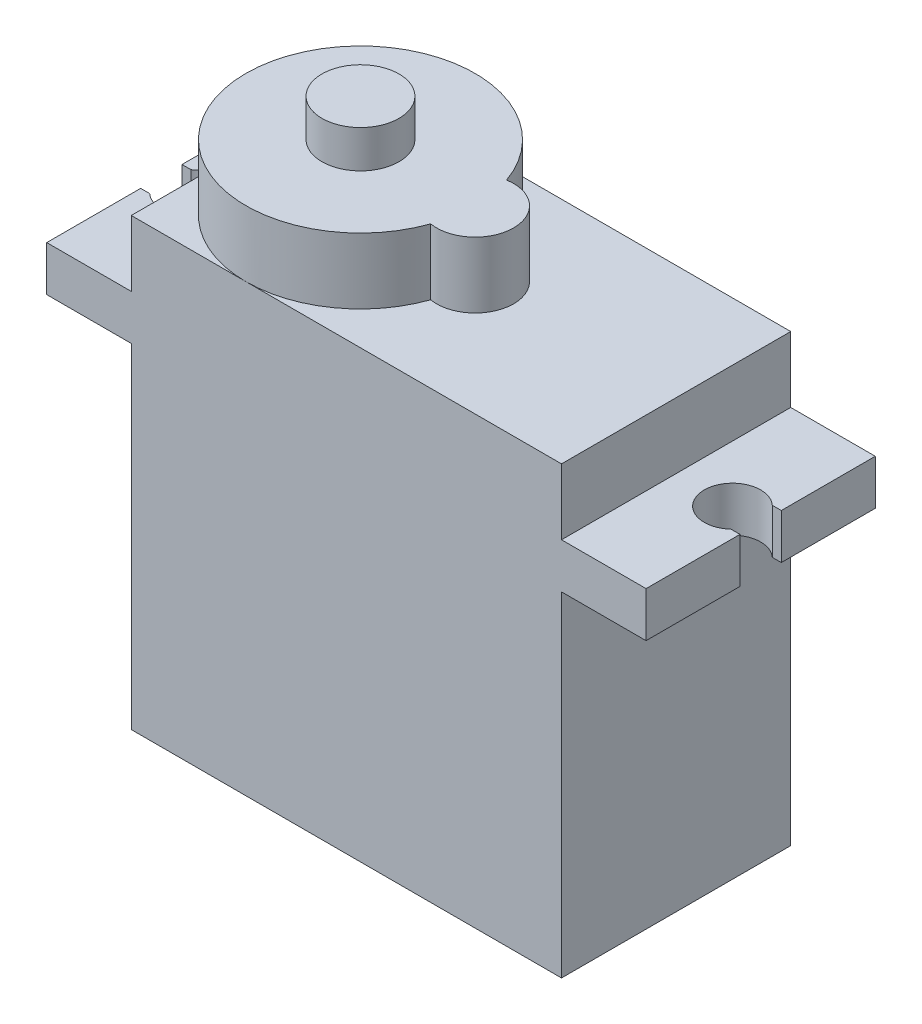
ISO-10303-21;
HEADER;
FILE_DESCRIPTION(('STEP AP214'),'2;1');
FILE_NAME('part.step','',(''),(''),'','','');
FILE_SCHEMA(('AUTOMOTIVE_DESIGN { 1 0 10303 214 1 1 1 1 }'));
ENDSEC;
DATA;
#1=APPLICATION_CONTEXT('core data for automotive mechanical design processes');
#2=APPLICATION_PROTOCOL_DEFINITION('international standard','automotive_design',2000,#1);
#3=PRODUCT_CONTEXT('',#1,'mechanical');
#4=PRODUCT('Part','Part','',(#3));
#5=PRODUCT_RELATED_PRODUCT_CATEGORY('part','',(#4));
#6=PRODUCT_DEFINITION_FORMATION('','',#4);
#7=PRODUCT_DEFINITION_CONTEXT('part definition',#1,'design');
#8=PRODUCT_DEFINITION('design','',#6,#7);
#9=PRODUCT_DEFINITION_SHAPE('','',#8);
#10=(LENGTH_UNIT() NAMED_UNIT(*) SI_UNIT(.MILLI.,.METRE.));
#11=(NAMED_UNIT(*) PLANE_ANGLE_UNIT() SI_UNIT($,.RADIAN.));
#12=(NAMED_UNIT(*) SI_UNIT($,.STERADIAN.) SOLID_ANGLE_UNIT());
#13=UNCERTAINTY_MEASURE_WITH_UNIT(LENGTH_MEASURE(1.E-05),#10,'distance_accuracy_value','');
#14=(GEOMETRIC_REPRESENTATION_CONTEXT(3) GLOBAL_UNCERTAINTY_ASSIGNED_CONTEXT((#13)) GLOBAL_UNIT_ASSIGNED_CONTEXT((#10,
#11,#12)) REPRESENTATION_CONTEXT('',''));
#15=CARTESIAN_POINT('',(0.,0.,0.));
#16=DIRECTION('',(0.,0.,1.));
#17=DIRECTION('',(1.,0.,0.));
#18=AXIS2_PLACEMENT_3D('',#15,#16,#17);
#19=CARTESIAN_POINT('',(15.95,0.,12.2));
#20=DIRECTION('',(1.,0.,0.));
#21=DIRECTION('',(0.,1.,0.));
#22=AXIS2_PLACEMENT_3D('',#19,#20,#21);
#23=PLANE('',#22);
#24=DIRECTION('',(0.,0.,-1.));
#25=VECTOR('',#24,1.);
#26=CARTESIAN_POINT('',(15.95,5.95000000000001,12.2));
#27=LINE('',#26,#25);
#28=CARTESIAN_POINT('',(15.95,5.95000000000001,12.2));
#29=VERTEX_POINT('',#28);
#30=CARTESIAN_POINT('',(15.95,5.95000000000001,7.2));
#31=VERTEX_POINT('',#30);
#32=EDGE_CURVE('E229',#29,#31,#27,.T.);
#33=ORIENTED_EDGE('',*,*,#32,.T.);
#34=DIRECTION('',(0.,1.,0.));
#35=VECTOR('',#34,1.);
#36=CARTESIAN_POINT('',(15.95,-11.851,7.2));
#37=LINE('',#36,#35);
#38=CARTESIAN_POINT('',(15.95,8.35,7.2));
#39=VERTEX_POINT('',#38);
#40=EDGE_CURVE('E222',#31,#39,#37,.T.);
#41=ORIENTED_EDGE('',*,*,#40,.T.);
#42=DIRECTION('',(0.,0.,-1.));
#43=VECTOR('',#42,1.);
#44=CARTESIAN_POINT('',(15.95,8.35000000000001,12.2));
#45=LINE('',#44,#43);
#46=CARTESIAN_POINT('',(15.95,8.35000000000001,12.2));
#47=VERTEX_POINT('',#46);
#48=EDGE_CURVE('E230',#47,#39,#45,.T.);
#49=ORIENTED_EDGE('',*,*,#48,.F.);
#50=DIRECTION('',(0.,-1.,0.));
#51=VECTOR('',#50,1.);
#52=CARTESIAN_POINT('',(15.95,0.,12.2));
#53=LINE('',#52,#51);
#54=EDGE_CURVE('E359',#47,#29,#53,.T.);
#55=ORIENTED_EDGE('',*,*,#54,.T.);
#56=EDGE_LOOP('',(#33,#41,#49,#55));
#57=FACE_BOUND('',#56,.T.);
#58=ADVANCED_FACE('F41',(#57),#23,.T.);
#59=CARTESIAN_POINT('',(-15.95,0.,12.2));
#60=DIRECTION('',(1.,0.,0.));
#61=DIRECTION('',(0.,0.,-1.));
#62=AXIS2_PLACEMENT_3D('',#59,#60,#61);
#63=PLANE('',#62);
#64=DIRECTION('',(0.,1.,0.));
#65=VECTOR('',#64,1.);
#66=CARTESIAN_POINT('',(-15.95,-11.851,5.));
#67=LINE('',#66,#65);
#68=CARTESIAN_POINT('',(-15.95,5.95000000000001,5.));
#69=VERTEX_POINT('',#68);
#70=CARTESIAN_POINT('',(-15.95,8.35,5.));
#71=VERTEX_POINT('',#70);
#72=EDGE_CURVE('E66',#69,#71,#67,.T.);
#73=ORIENTED_EDGE('',*,*,#72,.T.);
#74=DIRECTION('',(0.,0.,-1.));
#75=VECTOR('',#74,1.);
#76=CARTESIAN_POINT('',(-15.95,8.35000000000001,12.2));
#77=LINE('',#76,#75);
#78=CARTESIAN_POINT('',(-15.95,8.35000000000001,0.));
#79=VERTEX_POINT('',#78);
#80=EDGE_CURVE('E314',#71,#79,#77,.T.);
#81=ORIENTED_EDGE('',*,*,#80,.T.);
#82=DIRECTION('',(0.,-1.,0.));
#83=VECTOR('',#82,1.);
#84=CARTESIAN_POINT('',(-15.95,0.,0.));
#85=LINE('',#84,#83);
#86=CARTESIAN_POINT('',(-15.95,5.95000000000001,0.));
#87=VERTEX_POINT('',#86);
#88=EDGE_CURVE('E299',#79,#87,#85,.T.);
#89=ORIENTED_EDGE('',*,*,#88,.T.);
#90=DIRECTION('',(0.,0.,-1.));
#91=VECTOR('',#90,1.);
#92=CARTESIAN_POINT('',(-15.95,5.95000000000001,12.2));
#93=LINE('',#92,#91);
#94=EDGE_CURVE('E310',#69,#87,#93,.T.);
#95=ORIENTED_EDGE('',*,*,#94,.F.);
#96=EDGE_LOOP('',(#73,#81,#89,#95));
#97=FACE_BOUND('',#96,.T.);
#98=ADVANCED_FACE('F439',(#97),#63,.F.);
#99=CARTESIAN_POINT('',(0.,11.85,12.2));
#100=DIRECTION('',(0.,1.,0.));
#101=DIRECTION('',(0.,0.,1.));
#102=AXIS2_PLACEMENT_3D('',#99,#100,#101);
#103=PLANE('',#102);
#104=CARTESIAN_POINT('',(-5.35,11.85,6.1));
#105=DIRECTION('',(0.,1.,0.));
#106=DIRECTION('',(0.,0.,1.));
#107=AXIS2_PLACEMENT_3D('',#104,#105,#106);
#108=CIRCLE('',#107,6.1);
#109=CARTESIAN_POINT('',(0.405532786885243,11.85,4.07914811549957));
#110=VERTEX_POINT('',#109);
#111=CARTESIAN_POINT('',(-5.35,11.85,0.));
#112=VERTEX_POINT('',#111);
#113=EDGE_CURVE('E247',#110,#112,#108,.T.);
#114=ORIENTED_EDGE('',*,*,#113,.F.);
#115=CARTESIAN_POINT('',(0.749999999999997,11.85,6.1));
#116=DIRECTION('',(0.,1.,0.));
#117=DIRECTION('',(0.,0.,1.));
#118=AXIS2_PLACEMENT_3D('',#115,#116,#117);
#119=CIRCLE('',#118,2.05);
#120=CARTESIAN_POINT('',(0.405532786885243,11.85,8.12085188450043));
#121=VERTEX_POINT('',#120);
#122=EDGE_CURVE('E256',#110,#121,#119,.F.);
#123=ORIENTED_EDGE('',*,*,#122,.T.);
#124=CARTESIAN_POINT('',(-5.35,11.85,12.2));
#125=VERTEX_POINT('',#124);
#126=EDGE_CURVE('E240',#125,#121,#108,.T.);
#127=ORIENTED_EDGE('',*,*,#126,.F.);
#128=DIRECTION('',(1.,0.,0.));
#129=VECTOR('',#128,1.);
#130=CARTESIAN_POINT('',(0.,11.85,12.2));
#131=LINE('',#130,#129);
#132=CARTESIAN_POINT('',(11.45,11.85,12.2));
#133=VERTEX_POINT('',#132);
#134=EDGE_CURVE('E354',#125,#133,#131,.T.);
#135=ORIENTED_EDGE('',*,*,#134,.T.);
#136=DIRECTION('',(0.,0.,-1.));
#137=VECTOR('',#136,1.);
#138=CARTESIAN_POINT('',(11.45,11.85,12.2));
#139=LINE('',#138,#137);
#140=CARTESIAN_POINT('',(11.45,11.85,0.));
#141=VERTEX_POINT('',#140);
#142=EDGE_CURVE('E279',#133,#141,#139,.T.);
#143=ORIENTED_EDGE('',*,*,#142,.T.);
#144=DIRECTION('',(1.,0.,0.));
#145=VECTOR('',#144,1.);
#146=CARTESIAN_POINT('',(0.,11.85,0.));
#147=LINE('',#146,#145);
#148=EDGE_CURVE('E276',#112,#141,#147,.T.);
#149=ORIENTED_EDGE('',*,*,#148,.F.);
#150=EDGE_LOOP('',(#114,#123,#127,#135,#143,#149));
#151=FACE_BOUND('',#150,.T.);
#152=ADVANCED_FACE('F277',(#151),#103,.T.);
#153=CARTESIAN_POINT('',(-11.45,11.85,6.1));
#154=VERTEX_POINT('',#153);
#155=EDGE_CURVE('E50',#112,#154,#108,.T.);
#156=ORIENTED_EDGE('',*,*,#155,.F.);
#157=CARTESIAN_POINT('',(-11.45,11.85,0.));
#158=VERTEX_POINT('',#157);
#159=EDGE_CURVE('E270',#158,#112,#147,.T.);
#160=ORIENTED_EDGE('',*,*,#159,.F.);
#161=DIRECTION('',(0.,0.,-1.));
#162=VECTOR('',#161,1.);
#163=CARTESIAN_POINT('',(-11.45,11.85,12.2));
#164=LINE('',#163,#162);
#165=EDGE_CURVE('E272',#154,#158,#164,.T.);
#166=ORIENTED_EDGE('',*,*,#165,.F.);
#167=EDGE_LOOP('',(#156,#160,#166));
#168=FACE_BOUND('',#167,.T.);
#169=ADVANCED_FACE('F268',(#168),#103,.T.);
#170=CARTESIAN_POINT('',(0.,-11.85,12.2));
#171=DIRECTION('',(0.,1.,0.));
#172=DIRECTION('',(0.,0.,1.));
#173=AXIS2_PLACEMENT_3D('',#170,#171,#172);
#174=PLANE('',#173);
#175=DIRECTION('',(1.,0.,0.));
#176=VECTOR('',#175,1.);
#177=CARTESIAN_POINT('',(0.,-11.85,0.));
#178=LINE('',#177,#176);
#179=CARTESIAN_POINT('',(-11.45,-11.85,0.));
#180=VERTEX_POINT('',#179);
#181=CARTESIAN_POINT('',(11.45,-11.85,0.));
#182=VERTEX_POINT('',#181);
#183=EDGE_CURVE('E335',#180,#182,#178,.T.);
#184=ORIENTED_EDGE('',*,*,#183,.T.);
#185=DIRECTION('',(0.,0.,-1.));
#186=VECTOR('',#185,1.);
#187=CARTESIAN_POINT('',(11.45,-11.85,12.2));
#188=LINE('',#187,#186);
#189=CARTESIAN_POINT('',(11.45,-11.85,12.2));
#190=VERTEX_POINT('',#189);
#191=EDGE_CURVE('E45',#190,#182,#188,.T.);
#192=ORIENTED_EDGE('',*,*,#191,.F.);
#193=DIRECTION('',(1.,0.,0.));
#194=VECTOR('',#193,1.);
#195=CARTESIAN_POINT('',(0.,-11.85,12.2));
#196=LINE('',#195,#194);
#197=CARTESIAN_POINT('',(-11.45,-11.85,12.2));
#198=VERTEX_POINT('',#197);
#199=EDGE_CURVE('E366',#198,#190,#196,.T.);
#200=ORIENTED_EDGE('',*,*,#199,.F.);
#201=DIRECTION('',(0.,0.,-1.));
#202=VECTOR('',#201,1.);
#203=CARTESIAN_POINT('',(-11.45,-11.85,12.2));
#204=LINE('',#203,#202);
#205=EDGE_CURVE('E305',#198,#180,#204,.T.);
#206=ORIENTED_EDGE('',*,*,#205,.T.);
#207=EDGE_LOOP('',(#184,#192,#200,#206));
#208=FACE_BOUND('',#207,.T.);
#209=ADVANCED_FACE('F43',(#208),#174,.F.);
#210=CARTESIAN_POINT('',(11.45,0.,12.2));
#211=DIRECTION('',(-1.,0.,0.));
#212=DIRECTION('',(0.,0.,1.));
#213=AXIS2_PLACEMENT_3D('',#210,#211,#212);
#214=PLANE('',#213);
#215=DIRECTION('',(0.,1.,0.));
#216=VECTOR('',#215,1.);
#217=CARTESIAN_POINT('',(11.45,0.,0.));
#218=LINE('',#217,#216);
#219=CARTESIAN_POINT('',(11.45,5.95000000000001,0.));
#220=VERTEX_POINT('',#219);
#221=EDGE_CURVE('E332',#182,#220,#218,.T.);
#222=ORIENTED_EDGE('',*,*,#221,.T.);
#223=DIRECTION('',(0.,0.,-1.));
#224=VECTOR('',#223,1.);
#225=CARTESIAN_POINT('',(11.45,5.95000000000001,12.2));
#226=LINE('',#225,#224);
#227=CARTESIAN_POINT('',(11.45,5.95000000000001,12.2));
#228=VERTEX_POINT('',#227);
#229=EDGE_CURVE('E233',#228,#220,#226,.T.);
#230=ORIENTED_EDGE('',*,*,#229,.F.);
#231=DIRECTION('',(0.,1.,0.));
#232=VECTOR('',#231,1.);
#233=CARTESIAN_POINT('',(11.45,0.,12.2));
#234=LINE('',#233,#232);
#235=EDGE_CURVE('E364',#190,#228,#234,.T.);
#236=ORIENTED_EDGE('',*,*,#235,.F.);
#237=ORIENTED_EDGE('',*,*,#191,.T.);
#238=EDGE_LOOP('',(#222,#230,#236,#237));
#239=FACE_BOUND('',#238,.T.);
#240=ADVANCED_FACE('F426',(#239),#214,.F.);
#241=CARTESIAN_POINT('',(0.,5.95000000000001,12.2));
#242=DIRECTION('',(0.,1.,0.));
#243=DIRECTION('',(-1.,0.,0.));
#244=AXIS2_PLACEMENT_3D('',#241,#242,#243);
#245=PLANE('',#244);
#246=CARTESIAN_POINT('',(15.95,5.95000000000001,5.));
#247=VERTEX_POINT('',#246);
#248=CARTESIAN_POINT('',(15.95,5.95000000000001,0.));
#249=VERTEX_POINT('',#248);
#250=EDGE_CURVE('E219',#247,#249,#27,.T.);
#251=ORIENTED_EDGE('',*,*,#250,.F.);
#252=DIRECTION('',(1.,0.,0.));
#253=VECTOR('',#252,1.);
#254=CARTESIAN_POINT('',(0.,5.95000000000001,4.99999999999997));
#255=LINE('',#254,#253);
#256=CARTESIAN_POINT('',(15.4698039027186,5.95000000000001,5.));
#257=VERTEX_POINT('',#256);
#258=EDGE_CURVE('E203',#257,#247,#255,.T.);
#259=ORIENTED_EDGE('',*,*,#258,.F.);
#260=CARTESIAN_POINT('',(14.45,5.95000000000001,6.1));
#261=DIRECTION('',(0.,1.,0.));
#262=DIRECTION('',(-1.,0.,0.));
#263=AXIS2_PLACEMENT_3D('',#260,#261,#262);
#264=CIRCLE('',#263,1.5);
#265=CARTESIAN_POINT('',(15.4698039027186,5.95000000000001,7.2));
#266=VERTEX_POINT('',#265);
#267=EDGE_CURVE('E213',#257,#266,#264,.T.);
#268=ORIENTED_EDGE('',*,*,#267,.T.);
#269=DIRECTION('',(1.,0.,0.));
#270=VECTOR('',#269,1.);
#271=CARTESIAN_POINT('',(0.,5.95000000000001,7.2));
#272=LINE('',#271,#270);
#273=EDGE_CURVE('E401',#266,#31,#272,.T.);
#274=ORIENTED_EDGE('',*,*,#273,.T.);
#275=ORIENTED_EDGE('',*,*,#32,.F.);
#276=DIRECTION('',(1.,0.,0.));
#277=VECTOR('',#276,1.);
#278=CARTESIAN_POINT('',(0.,5.95000000000001,12.2));
#279=LINE('',#278,#277);
#280=EDGE_CURVE('E362',#228,#29,#279,.T.);
#281=ORIENTED_EDGE('',*,*,#280,.F.);
#282=ORIENTED_EDGE('',*,*,#229,.T.);
#283=DIRECTION('',(1.,0.,0.));
#284=VECTOR('',#283,1.);
#285=CARTESIAN_POINT('',(0.,5.95000000000001,0.));
#286=LINE('',#285,#284);
#287=EDGE_CURVE('E227',#220,#249,#286,.T.);
#288=ORIENTED_EDGE('',*,*,#287,.T.);
#289=EDGE_LOOP('',(#251,#259,#268,#274,#275,#281,#282,#288));
#290=FACE_BOUND('',#289,.T.);
#291=ADVANCED_FACE('F224',(#290),#245,.F.);
#292=DIRECTION('',(0.,1.,0.));
#293=VECTOR('',#292,1.);
#294=CARTESIAN_POINT('',(15.95,-11.851,5.));
#295=LINE('',#294,#293);
#296=CARTESIAN_POINT('',(15.95,8.35,5.));
#297=VERTEX_POINT('',#296);
#298=EDGE_CURVE('E207',#247,#297,#295,.T.);
#299=ORIENTED_EDGE('',*,*,#298,.F.);
#300=ORIENTED_EDGE('',*,*,#250,.T.);
#301=DIRECTION('',(0.,-1.,0.));
#302=VECTOR('',#301,1.);
#303=CARTESIAN_POINT('',(15.95,0.,0.));
#304=LINE('',#303,#302);
#305=CARTESIAN_POINT('',(15.95,8.35000000000001,0.));
#306=VERTEX_POINT('',#305);
#307=EDGE_CURVE('E330',#306,#249,#304,.T.);
#308=ORIENTED_EDGE('',*,*,#307,.F.);
#309=EDGE_CURVE('E221',#297,#306,#45,.T.);
#310=ORIENTED_EDGE('',*,*,#309,.F.);
#311=EDGE_LOOP('',(#299,#300,#308,#310));
#312=FACE_BOUND('',#311,.T.);
#313=ADVANCED_FACE('F217',(#312),#23,.T.);
#314=CARTESIAN_POINT('',(0.,8.35,12.2));
#315=DIRECTION('',(0.,1.,0.));
#316=DIRECTION('',(-1.,0.,0.));
#317=AXIS2_PLACEMENT_3D('',#314,#315,#316);
#318=PLANE('',#317);
#319=DIRECTION('',(-1.,0.,0.));
#320=VECTOR('',#319,1.);
#321=CARTESIAN_POINT('',(0.,8.35,4.99999999999997));
#322=LINE('',#321,#320);
#323=CARTESIAN_POINT('',(15.4698039027185,8.35,5.));
#324=VERTEX_POINT('',#323);
#325=EDGE_CURVE('E329',#297,#324,#322,.T.);
#326=ORIENTED_EDGE('',*,*,#325,.F.);
#327=ORIENTED_EDGE('',*,*,#309,.T.);
#328=DIRECTION('',(1.,0.,0.));
#329=VECTOR('',#328,1.);
#330=CARTESIAN_POINT('',(0.,8.35,0.));
#331=LINE('',#330,#329);
#332=CARTESIAN_POINT('',(11.45,8.35000000000001,0.));
#333=VERTEX_POINT('',#332);
#334=EDGE_CURVE('E294',#333,#306,#331,.T.);
#335=ORIENTED_EDGE('',*,*,#334,.F.);
#336=DIRECTION('',(0.,0.,-1.));
#337=VECTOR('',#336,1.);
#338=CARTESIAN_POINT('',(11.45,8.35000000000001,12.2));
#339=LINE('',#338,#337);
#340=CARTESIAN_POINT('',(11.45,8.35000000000001,12.2));
#341=VERTEX_POINT('',#340);
#342=EDGE_CURVE('E322',#341,#333,#339,.T.);
#343=ORIENTED_EDGE('',*,*,#342,.F.);
#344=DIRECTION('',(1.,0.,0.));
#345=VECTOR('',#344,1.);
#346=CARTESIAN_POINT('',(0.,8.35,12.2));
#347=LINE('',#346,#345);
#348=EDGE_CURVE('E355',#341,#47,#347,.T.);
#349=ORIENTED_EDGE('',*,*,#348,.T.);
#350=ORIENTED_EDGE('',*,*,#48,.T.);
#351=DIRECTION('',(-1.,0.,0.));
#352=VECTOR('',#351,1.);
#353=CARTESIAN_POINT('',(0.,8.35,7.2));
#354=LINE('',#353,#352);
#355=CARTESIAN_POINT('',(15.4698039027186,8.35000000000001,7.2));
#356=VERTEX_POINT('',#355);
#357=EDGE_CURVE('E410',#39,#356,#354,.T.);
#358=ORIENTED_EDGE('',*,*,#357,.T.);
#359=CARTESIAN_POINT('',(14.45,8.35,6.1));
#360=DIRECTION('',(0.,-1.,0.));
#361=DIRECTION('',(1.,0.,0.));
#362=AXIS2_PLACEMENT_3D('',#359,#360,#361);
#363=CIRCLE('',#362,1.5);
#364=EDGE_CURVE('E58',#356,#324,#363,.T.);
#365=ORIENTED_EDGE('',*,*,#364,.T.);
#366=EDGE_LOOP('',(#326,#327,#335,#343,#349,#350,#358,#365));
#367=FACE_BOUND('',#366,.T.);
#368=ADVANCED_FACE('F327',(#367),#318,.T.);
#369=EDGE_CURVE('E283',#333,#141,#218,.T.);
#370=ORIENTED_EDGE('',*,*,#369,.T.);
#371=ORIENTED_EDGE('',*,*,#142,.F.);
#372=EDGE_CURVE('E358',#341,#133,#234,.T.);
#373=ORIENTED_EDGE('',*,*,#372,.F.);
#374=ORIENTED_EDGE('',*,*,#342,.T.);
#375=EDGE_LOOP('',(#370,#371,#373,#374));
#376=FACE_BOUND('',#375,.T.);
#377=ADVANCED_FACE('F429',(#376),#214,.F.);
#378=EDGE_CURVE('E245',#154,#125,#108,.T.);
#379=ORIENTED_EDGE('',*,*,#378,.F.);
#380=CARTESIAN_POINT('',(-11.45,11.85,12.2));
#381=VERTEX_POINT('',#380);
#382=EDGE_CURVE('E320',#381,#154,#164,.T.);
#383=ORIENTED_EDGE('',*,*,#382,.F.);
#384=EDGE_CURVE('E351',#381,#125,#131,.T.);
#385=ORIENTED_EDGE('',*,*,#384,.T.);
#386=EDGE_LOOP('',(#379,#383,#385));
#387=FACE_BOUND('',#386,.T.);
#388=ADVANCED_FACE('F437',(#387),#103,.T.);
#389=CARTESIAN_POINT('',(-11.45,0.,12.2));
#390=DIRECTION('',(-1.,0.,0.));
#391=DIRECTION('',(0.,0.,1.));
#392=AXIS2_PLACEMENT_3D('',#389,#390,#391);
#393=PLANE('',#392);
#394=DIRECTION('',(0.,1.,0.));
#395=VECTOR('',#394,1.);
#396=CARTESIAN_POINT('',(-11.45,0.,0.));
#397=LINE('',#396,#395);
#398=CARTESIAN_POINT('',(-11.45,8.35000000000001,0.));
#399=VERTEX_POINT('',#398);
#400=EDGE_CURVE('E289',#399,#158,#397,.T.);
#401=ORIENTED_EDGE('',*,*,#400,.F.);
#402=DIRECTION('',(0.,0.,-1.));
#403=VECTOR('',#402,1.);
#404=CARTESIAN_POINT('',(-11.45,8.35000000000001,12.2));
#405=LINE('',#404,#403);
#406=CARTESIAN_POINT('',(-11.45,8.35000000000001,12.2));
#407=VERTEX_POINT('',#406);
#408=EDGE_CURVE('E318',#407,#399,#405,.T.);
#409=ORIENTED_EDGE('',*,*,#408,.F.);
#410=DIRECTION('',(0.,1.,0.));
#411=VECTOR('',#410,1.);
#412=CARTESIAN_POINT('',(-11.45,0.,12.2));
#413=LINE('',#412,#411);
#414=EDGE_CURVE('E348',#407,#381,#413,.T.);
#415=ORIENTED_EDGE('',*,*,#414,.T.);
#416=ORIENTED_EDGE('',*,*,#382,.T.);
#417=ORIENTED_EDGE('',*,*,#165,.T.);
#418=EDGE_LOOP('',(#401,#409,#415,#416,#417));
#419=FACE_BOUND('',#418,.T.);
#420=ADVANCED_FACE('F604',(#419),#393,.T.);
#421=CARTESIAN_POINT('',(0.,8.35,12.2));
#422=DIRECTION('',(0.,-1.,0.));
#423=DIRECTION('',(1.,0.,0.));
#424=AXIS2_PLACEMENT_3D('',#421,#422,#423);
#425=PLANE('',#424);
#426=CARTESIAN_POINT('',(-14.45,8.35,6.1));
#427=DIRECTION('',(0.,1.,0.));
#428=DIRECTION('',(-1.,0.,0.));
#429=AXIS2_PLACEMENT_3D('',#426,#427,#428);
#430=CIRCLE('',#429,1.5);
#431=CARTESIAN_POINT('',(-15.4698039027186,8.35,7.2));
#432=VERTEX_POINT('',#431);
#433=CARTESIAN_POINT('',(-15.4698039027185,8.35,5.));
#434=VERTEX_POINT('',#433);
#435=EDGE_CURVE('E392',#432,#434,#430,.T.);
#436=ORIENTED_EDGE('',*,*,#435,.F.);
#437=DIRECTION('',(1.,0.,0.));
#438=VECTOR('',#437,1.);
#439=CARTESIAN_POINT('',(0.,8.35,7.2));
#440=LINE('',#439,#438);
#441=CARTESIAN_POINT('',(-15.95,8.35,7.2));
#442=VERTEX_POINT('',#441);
#443=EDGE_CURVE('E382',#442,#432,#440,.T.);
#444=ORIENTED_EDGE('',*,*,#443,.F.);
#445=CARTESIAN_POINT('',(-15.95,8.35000000000001,12.2));
#446=VERTEX_POINT('',#445);
#447=EDGE_CURVE('E315',#446,#442,#77,.T.);
#448=ORIENTED_EDGE('',*,*,#447,.F.);
#449=DIRECTION('',(-1.,0.,0.));
#450=VECTOR('',#449,1.);
#451=CARTESIAN_POINT('',(0.,8.35,12.2));
#452=LINE('',#451,#450);
#453=EDGE_CURVE('E346',#407,#446,#452,.T.);
#454=ORIENTED_EDGE('',*,*,#453,.F.);
#455=ORIENTED_EDGE('',*,*,#408,.T.);
#456=DIRECTION('',(-1.,0.,0.));
#457=VECTOR('',#456,1.);
#458=CARTESIAN_POINT('',(0.,8.35,0.));
#459=LINE('',#458,#457);
#460=EDGE_CURVE('E290',#399,#79,#459,.T.);
#461=ORIENTED_EDGE('',*,*,#460,.T.);
#462=ORIENTED_EDGE('',*,*,#80,.F.);
#463=DIRECTION('',(1.,0.,0.));
#464=VECTOR('',#463,1.);
#465=CARTESIAN_POINT('',(0.,8.35,4.99999999999997));
#466=LINE('',#465,#464);
#467=EDGE_CURVE('E389',#71,#434,#466,.T.);
#468=ORIENTED_EDGE('',*,*,#467,.T.);
#469=EDGE_LOOP('',(#436,#444,#448,#454,#455,#461,#462,#468));
#470=FACE_BOUND('',#469,.T.);
#471=ADVANCED_FACE('F619',(#470),#425,.F.);
#472=ORIENTED_EDGE('',*,*,#447,.T.);
#473=DIRECTION('',(0.,1.,0.));
#474=VECTOR('',#473,1.);
#475=CARTESIAN_POINT('',(-15.95,-11.851,7.2));
#476=LINE('',#475,#474);
#477=CARTESIAN_POINT('',(-15.95,5.95000000000001,7.2));
#478=VERTEX_POINT('',#477);
#479=EDGE_CURVE('E384',#478,#442,#476,.T.);
#480=ORIENTED_EDGE('',*,*,#479,.F.);
#481=CARTESIAN_POINT('',(-15.95,5.95000000000001,12.2));
#482=VERTEX_POINT('',#481);
#483=EDGE_CURVE('E311',#482,#478,#93,.T.);
#484=ORIENTED_EDGE('',*,*,#483,.F.);
#485=DIRECTION('',(0.,-1.,0.));
#486=VECTOR('',#485,1.);
#487=CARTESIAN_POINT('',(-15.95,0.,12.2));
#488=LINE('',#487,#486);
#489=EDGE_CURVE('E344',#446,#482,#488,.T.);
#490=ORIENTED_EDGE('',*,*,#489,.F.);
#491=EDGE_LOOP('',(#472,#480,#484,#490));
#492=FACE_BOUND('',#491,.T.);
#493=ADVANCED_FACE('F447',(#492),#63,.F.);
#494=CARTESIAN_POINT('',(0.,5.95,12.2));
#495=DIRECTION('',(0.,-1.,0.));
#496=DIRECTION('',(1.,0.,0.));
#497=AXIS2_PLACEMENT_3D('',#494,#495,#496);
#498=PLANE('',#497);
#499=DIRECTION('',(1.,0.,0.));
#500=VECTOR('',#499,1.);
#501=CARTESIAN_POINT('',(0.,5.95,7.2));
#502=LINE('',#501,#500);
#503=CARTESIAN_POINT('',(-15.4698039027186,5.95000000000001,7.2));
#504=VERTEX_POINT('',#503);
#505=EDGE_CURVE('E395',#478,#504,#502,.T.);
#506=ORIENTED_EDGE('',*,*,#505,.T.);
#507=CARTESIAN_POINT('',(-14.45,5.95000000000001,6.1));
#508=DIRECTION('',(0.,-1.,0.));
#509=DIRECTION('',(1.,0.,0.));
#510=AXIS2_PLACEMENT_3D('',#507,#508,#509);
#511=CIRCLE('',#510,1.5);
#512=CARTESIAN_POINT('',(-15.4698039027185,5.95000000000001,5.));
#513=VERTEX_POINT('',#512);
#514=EDGE_CURVE('E398',#504,#513,#511,.F.);
#515=ORIENTED_EDGE('',*,*,#514,.T.);
#516=DIRECTION('',(1.,0.,0.));
#517=VECTOR('',#516,1.);
#518=CARTESIAN_POINT('',(0.,5.95,4.99999999999997));
#519=LINE('',#518,#517);
#520=EDGE_CURVE('E377',#69,#513,#519,.T.);
#521=ORIENTED_EDGE('',*,*,#520,.F.);
#522=ORIENTED_EDGE('',*,*,#94,.T.);
#523=DIRECTION('',(-1.,0.,0.));
#524=VECTOR('',#523,1.);
#525=CARTESIAN_POINT('',(0.,5.95,0.));
#526=LINE('',#525,#524);
#527=CARTESIAN_POINT('',(-11.45,5.95000000000001,0.));
#528=VERTEX_POINT('',#527);
#529=EDGE_CURVE('E302',#528,#87,#526,.T.);
#530=ORIENTED_EDGE('',*,*,#529,.F.);
#531=DIRECTION('',(0.,0.,-1.));
#532=VECTOR('',#531,1.);
#533=CARTESIAN_POINT('',(-11.45,5.95000000000001,12.2));
#534=LINE('',#533,#532);
#535=CARTESIAN_POINT('',(-11.45,5.95000000000001,12.2));
#536=VERTEX_POINT('',#535);
#537=EDGE_CURVE('E307',#536,#528,#534,.T.);
#538=ORIENTED_EDGE('',*,*,#537,.F.);
#539=DIRECTION('',(-1.,0.,0.));
#540=VECTOR('',#539,1.);
#541=CARTESIAN_POINT('',(0.,5.95,12.2));
#542=LINE('',#541,#540);
#543=EDGE_CURVE('E341',#536,#482,#542,.T.);
#544=ORIENTED_EDGE('',*,*,#543,.T.);
#545=ORIENTED_EDGE('',*,*,#483,.T.);
#546=EDGE_LOOP('',(#506,#515,#521,#522,#530,#538,#544,#545));
#547=FACE_BOUND('',#546,.T.);
#548=ADVANCED_FACE('F601',(#547),#498,.T.);
#549=EDGE_CURVE('E292',#180,#528,#397,.T.);
#550=ORIENTED_EDGE('',*,*,#549,.F.);
#551=ORIENTED_EDGE('',*,*,#205,.F.);
#552=EDGE_CURVE('E308',#198,#536,#413,.T.);
#553=ORIENTED_EDGE('',*,*,#552,.T.);
#554=ORIENTED_EDGE('',*,*,#537,.T.);
#555=EDGE_LOOP('',(#550,#551,#553,#554));
#556=FACE_BOUND('',#555,.T.);
#557=ADVANCED_FACE('F592',(#556),#393,.T.);
#558=CARTESIAN_POINT('',(0.,0.,12.2));
#559=DIRECTION('',(0.,0.,1.));
#560=DIRECTION('',(1.,0.,0.));
#561=AXIS2_PLACEMENT_3D('',#558,#559,#560);
#562=PLANE('',#561);
#563=ORIENTED_EDGE('',*,*,#199,.T.);
#564=ORIENTED_EDGE('',*,*,#235,.T.);
#565=ORIENTED_EDGE('',*,*,#280,.T.);
#566=ORIENTED_EDGE('',*,*,#54,.F.);
#567=ORIENTED_EDGE('',*,*,#348,.F.);
#568=ORIENTED_EDGE('',*,*,#372,.T.);
#569=ORIENTED_EDGE('',*,*,#134,.F.);
#570=ORIENTED_EDGE('',*,*,#384,.F.);
#571=ORIENTED_EDGE('',*,*,#414,.F.);
#572=ORIENTED_EDGE('',*,*,#453,.T.);
#573=ORIENTED_EDGE('',*,*,#489,.T.);
#574=ORIENTED_EDGE('',*,*,#543,.F.);
#575=ORIENTED_EDGE('',*,*,#552,.F.);
#576=EDGE_LOOP('',(#563,#564,#565,#566,#567,#568,#569,#570,#571,#572,#573,#574,#575));
#577=FACE_BOUND('',#576,.T.);
#578=ADVANCED_FACE('F422',(#577),#562,.T.);
#579=CARTESIAN_POINT('',(0.,0.,0.));
#580=DIRECTION('',(0.,0.,1.));
#581=DIRECTION('',(1.,0.,0.));
#582=AXIS2_PLACEMENT_3D('',#579,#580,#581);
#583=PLANE('',#582);
#584=ORIENTED_EDGE('',*,*,#183,.F.);
#585=ORIENTED_EDGE('',*,*,#549,.T.);
#586=ORIENTED_EDGE('',*,*,#529,.T.);
#587=ORIENTED_EDGE('',*,*,#88,.F.);
#588=ORIENTED_EDGE('',*,*,#460,.F.);
#589=ORIENTED_EDGE('',*,*,#400,.T.);
#590=ORIENTED_EDGE('',*,*,#159,.T.);
#591=ORIENTED_EDGE('',*,*,#148,.T.);
#592=ORIENTED_EDGE('',*,*,#369,.F.);
#593=ORIENTED_EDGE('',*,*,#334,.T.);
#594=ORIENTED_EDGE('',*,*,#307,.T.);
#595=ORIENTED_EDGE('',*,*,#287,.F.);
#596=ORIENTED_EDGE('',*,*,#221,.F.);
#597=EDGE_LOOP('',(#584,#585,#586,#587,#588,#589,#590,#591,#592,#593,#594,#595,#596));
#598=FACE_BOUND('',#597,.T.);
#599=ADVANCED_FACE('F286',(#598),#583,.F.);
#600=CARTESIAN_POINT('',(0.749999999999997,15.35,6.1));
#601=DIRECTION('',(0.,-1.,0.));
#602=DIRECTION('',(0.,0.,-1.));
#603=AXIS2_PLACEMENT_3D('',#600,#601,#602);
#604=CYLINDRICAL_SURFACE('',#603,2.05);
#605=ORIENTED_EDGE('',*,*,#122,.F.);
#606=DIRECTION('',(0.,-1.,0.));
#607=VECTOR('',#606,1.);
#608=CARTESIAN_POINT('',(0.405532786885243,15.35,4.07914811549957));
#609=LINE('',#608,#607);
#610=CARTESIAN_POINT('',(0.405532786885243,15.35,4.07914811549957));
#611=VERTEX_POINT('',#610);
#612=EDGE_CURVE('E336',#611,#110,#609,.T.);
#613=ORIENTED_EDGE('',*,*,#612,.F.);
#614=CARTESIAN_POINT('',(0.749999999999997,15.35,6.1));
#615=DIRECTION('',(0.,1.,0.));
#616=DIRECTION('',(0.,0.,1.));
#617=AXIS2_PLACEMENT_3D('',#614,#615,#616);
#618=CIRCLE('',#617,2.05);
#619=CARTESIAN_POINT('',(0.405532786885243,15.35,8.12085188450043));
#620=VERTEX_POINT('',#619);
#621=EDGE_CURVE('E255',#611,#620,#618,.F.);
#622=ORIENTED_EDGE('',*,*,#621,.T.);
#623=DIRECTION('',(0.,-1.,0.));
#624=VECTOR('',#623,1.);
#625=CARTESIAN_POINT('',(0.405532786885243,15.35,8.12085188450043));
#626=LINE('',#625,#624);
#627=EDGE_CURVE('E338',#620,#121,#626,.T.);
#628=ORIENTED_EDGE('',*,*,#627,.T.);
#629=EDGE_LOOP('',(#605,#613,#622,#628));
#630=FACE_BOUND('',#629,.T.);
#631=ADVANCED_FACE('F551',(#630),#604,.T.);
#632=CARTESIAN_POINT('',(-5.35,15.35,6.1));
#633=DIRECTION('',(0.,-1.,0.));
#634=DIRECTION('',(0.,0.,-1.));
#635=AXIS2_PLACEMENT_3D('',#632,#633,#634);
#636=CYLINDRICAL_SURFACE('',#635,6.1);
#637=ORIENTED_EDGE('',*,*,#113,.T.);
#638=ORIENTED_EDGE('',*,*,#155,.T.);
#639=ORIENTED_EDGE('',*,*,#378,.T.);
#640=ORIENTED_EDGE('',*,*,#126,.T.);
#641=ORIENTED_EDGE('',*,*,#627,.F.);
#642=CARTESIAN_POINT('',(-5.35,15.35,6.1));
#643=DIRECTION('',(0.,1.,0.));
#644=DIRECTION('',(0.,0.,1.));
#645=AXIS2_PLACEMENT_3D('',#642,#643,#644);
#646=CIRCLE('',#645,6.1);
#647=EDGE_CURVE('E260',#611,#620,#646,.T.);
#648=ORIENTED_EDGE('',*,*,#647,.F.);
#649=ORIENTED_EDGE('',*,*,#612,.T.);
#650=EDGE_LOOP('',(#637,#638,#639,#640,#641,#648,#649));
#651=FACE_BOUND('',#650,.T.);
#652=ADVANCED_FACE('F263',(#651),#636,.T.);
#653=CARTESIAN_POINT('',(0.,15.35,0.));
#654=DIRECTION('',(0.,1.,0.));
#655=DIRECTION('',(0.,0.,1.));
#656=AXIS2_PLACEMENT_3D('',#653,#654,#655);
#657=PLANE('',#656);
#658=CARTESIAN_POINT('',(-5.35,15.35,6.1));
#659=DIRECTION('',(0.,1.,0.));
#660=DIRECTION('',(0.,0.,1.));
#661=AXIS2_PLACEMENT_3D('',#658,#659,#660);
#662=CIRCLE('',#661,2.05);
#663=CARTESIAN_POINT('',(-5.35,15.35,8.15));
#664=VERTEX_POINT('',#663);
#665=EDGE_CURVE('E11',#664,#664,#662,.T.);
#666=ORIENTED_EDGE('',*,*,#665,.F.);
#667=EDGE_LOOP('',(#666));
#668=FACE_BOUND('',#667,.T.);
#669=ORIENTED_EDGE('',*,*,#621,.F.);
#670=ORIENTED_EDGE('',*,*,#647,.T.);
#671=EDGE_LOOP('',(#669,#670));
#672=FACE_BOUND('',#671,.T.);
#673=ADVANCED_FACE('F533',(#668,#672),#657,.T.);
#674=CARTESIAN_POINT('',(-5.35,17.35,6.1));
#675=DIRECTION('',(0.,-1.,0.));
#676=DIRECTION('',(0.,0.,-1.));
#677=AXIS2_PLACEMENT_3D('',#674,#675,#676);
#678=CYLINDRICAL_SURFACE('',#677,2.05);
#679=CARTESIAN_POINT('',(-5.35,17.35,6.1));
#680=DIRECTION('',(0.,1.,0.));
#681=DIRECTION('',(0.,0.,1.));
#682=AXIS2_PLACEMENT_3D('',#679,#680,#681);
#683=CIRCLE('',#682,2.05);
#684=CARTESIAN_POINT('',(-5.35,17.35,8.15));
#685=VERTEX_POINT('',#684);
#686=EDGE_CURVE('E262',#685,#685,#683,.T.);
#687=ORIENTED_EDGE('',*,*,#686,.F.);
#688=EDGE_LOOP('',(#687));
#689=FACE_BOUND('',#688,.T.);
#690=ORIENTED_EDGE('',*,*,#665,.T.);
#691=EDGE_LOOP('',(#690));
#692=FACE_BOUND('',#691,.T.);
#693=ADVANCED_FACE('F524',(#689,#692),#678,.T.);
#694=CARTESIAN_POINT('',(-5.35,17.35,6.1));
#695=DIRECTION('',(0.,1.,0.));
#696=DIRECTION('',(0.,0.,1.));
#697=AXIS2_PLACEMENT_3D('',#694,#695,#696);
#698=PLANE('',#697);
#699=ORIENTED_EDGE('',*,*,#686,.T.);
#700=EDGE_LOOP('',(#699));
#701=FACE_BOUND('',#700,.T.);
#702=ADVANCED_FACE('F508',(#701),#698,.T.);
#703=CARTESIAN_POINT('',(-14.45,-11.851,6.1));
#704=DIRECTION('',(0.,1.,0.));
#705=DIRECTION('',(-1.,0.,0.));
#706=AXIS2_PLACEMENT_3D('',#703,#704,#705);
#707=CYLINDRICAL_SURFACE('',#706,1.5);
#708=DIRECTION('',(0.,1.,0.));
#709=VECTOR('',#708,1.);
#710=CARTESIAN_POINT('',(-15.4698039027186,-11.851,7.2));
#711=LINE('',#710,#709);
#712=EDGE_CURVE('E379',#504,#432,#711,.T.);
#713=ORIENTED_EDGE('',*,*,#712,.T.);
#714=ORIENTED_EDGE('',*,*,#435,.T.);
#715=DIRECTION('',(0.,1.,0.));
#716=VECTOR('',#715,1.);
#717=CARTESIAN_POINT('',(-15.4698039027186,-11.851,5.));
#718=LINE('',#717,#716);
#719=EDGE_CURVE('E380',#513,#434,#718,.T.);
#720=ORIENTED_EDGE('',*,*,#719,.F.);
#721=ORIENTED_EDGE('',*,*,#514,.F.);
#722=EDGE_LOOP('',(#713,#714,#720,#721));
#723=FACE_BOUND('',#722,.T.);
#724=ADVANCED_FACE('F499',(#723),#707,.F.);
#725=CARTESIAN_POINT('',(0.,-11.851,7.2));
#726=DIRECTION('',(0.,0.,1.));
#727=DIRECTION('',(1.,0.,0.));
#728=AXIS2_PLACEMENT_3D('',#725,#726,#727);
#729=PLANE('',#728);
#730=ORIENTED_EDGE('',*,*,#479,.T.);
#731=ORIENTED_EDGE('',*,*,#443,.T.);
#732=ORIENTED_EDGE('',*,*,#712,.F.);
#733=ORIENTED_EDGE('',*,*,#505,.F.);
#734=EDGE_LOOP('',(#730,#731,#732,#733));
#735=FACE_BOUND('',#734,.T.);
#736=ADVANCED_FACE('F491',(#735),#729,.F.);
#737=CARTESIAN_POINT('',(0.,-11.851,4.99999999999997));
#738=DIRECTION('',(0.,0.,1.));
#739=DIRECTION('',(1.,0.,0.));
#740=AXIS2_PLACEMENT_3D('',#737,#738,#739);
#741=PLANE('',#740);
#742=ORIENTED_EDGE('',*,*,#520,.T.);
#743=ORIENTED_EDGE('',*,*,#719,.T.);
#744=ORIENTED_EDGE('',*,*,#467,.F.);
#745=ORIENTED_EDGE('',*,*,#72,.F.);
#746=EDGE_LOOP('',(#742,#743,#744,#745));
#747=FACE_BOUND('',#746,.T.);
#748=ADVANCED_FACE('F462',(#747),#741,.T.);
#749=CARTESIAN_POINT('',(14.45,-11.851,6.1));
#750=DIRECTION('',(0.,1.,0.));
#751=DIRECTION('',(-1.,0.,0.));
#752=AXIS2_PLACEMENT_3D('',#749,#750,#751);
#753=CYLINDRICAL_SURFACE('',#752,1.5);
#754=DIRECTION('',(0.,1.,0.));
#755=VECTOR('',#754,1.);
#756=CARTESIAN_POINT('',(15.4698039027186,-11.851,5.));
#757=LINE('',#756,#755);
#758=EDGE_CURVE('E209',#257,#324,#757,.T.);
#759=ORIENTED_EDGE('',*,*,#758,.T.);
#760=ORIENTED_EDGE('',*,*,#364,.F.);
#761=DIRECTION('',(0.,1.,0.));
#762=VECTOR('',#761,1.);
#763=CARTESIAN_POINT('',(15.4698039027186,-11.851,7.2));
#764=LINE('',#763,#762);
#765=EDGE_CURVE('E404',#266,#356,#764,.T.);
#766=ORIENTED_EDGE('',*,*,#765,.F.);
#767=ORIENTED_EDGE('',*,*,#267,.F.);
#768=EDGE_LOOP('',(#759,#760,#766,#767));
#769=FACE_BOUND('',#768,.T.);
#770=ADVANCED_FACE('F415',(#769),#753,.F.);
#771=CARTESIAN_POINT('',(0.,-11.851,4.99999999999997));
#772=DIRECTION('',(0.,0.,-1.));
#773=DIRECTION('',(-1.,0.,0.));
#774=AXIS2_PLACEMENT_3D('',#771,#772,#773);
#775=PLANE('',#774);
#776=ORIENTED_EDGE('',*,*,#258,.T.);
#777=ORIENTED_EDGE('',*,*,#298,.T.);
#778=ORIENTED_EDGE('',*,*,#325,.T.);
#779=ORIENTED_EDGE('',*,*,#758,.F.);
#780=EDGE_LOOP('',(#776,#777,#778,#779));
#781=FACE_BOUND('',#780,.T.);
#782=ADVANCED_FACE('F205',(#781),#775,.F.);
#783=CARTESIAN_POINT('',(0.,-11.851,7.2));
#784=DIRECTION('',(0.,0.,-1.));
#785=DIRECTION('',(-1.,0.,0.));
#786=AXIS2_PLACEMENT_3D('',#783,#784,#785);
#787=PLANE('',#786);
#788=ORIENTED_EDGE('',*,*,#765,.T.);
#789=ORIENTED_EDGE('',*,*,#357,.F.);
#790=ORIENTED_EDGE('',*,*,#40,.F.);
#791=ORIENTED_EDGE('',*,*,#273,.F.);
#792=EDGE_LOOP('',(#788,#789,#790,#791));
#793=FACE_BOUND('',#792,.T.);
#794=ADVANCED_FACE('F417',(#793),#787,.T.);
#795=CLOSED_SHELL('',(#58,#98,#152,#169,#209,#240,#291,#313,#368,#377,#388,#420,#471,#493,#548,
#557,#578,#599,#631,#652,#673,#693,#702,#724,#736,#748,#770,#782,#794));
#796=MANIFOLD_SOLID_BREP('B2',#795);
#797=ADVANCED_BREP_SHAPE_REPRESENTATION('',(#18,#796),#14);
#798=SHAPE_DEFINITION_REPRESENTATION(#9,#797);
ENDSEC;
END-ISO-10303-21;
